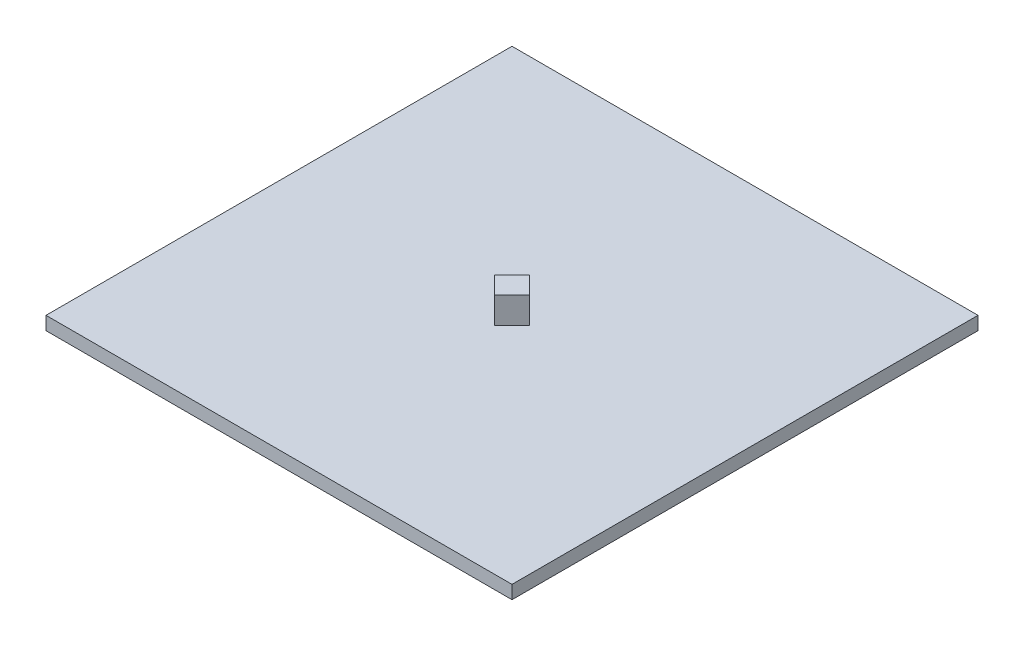
ISO-10303-21;
HEADER;
FILE_DESCRIPTION(('STEP AP214'),'2;1');
FILE_NAME('part.step','',(''),(''),'','','');
FILE_SCHEMA(('AUTOMOTIVE_DESIGN { 1 0 10303 214 1 1 1 1 }'));
ENDSEC;
DATA;
#1=APPLICATION_CONTEXT('core data for automotive mechanical design processes');
#2=APPLICATION_PROTOCOL_DEFINITION('international standard','automotive_design',2000,#1);
#3=PRODUCT_CONTEXT('',#1,'mechanical');
#4=PRODUCT('Part','Part','',(#3));
#5=PRODUCT_RELATED_PRODUCT_CATEGORY('part','',(#4));
#6=PRODUCT_DEFINITION_FORMATION('','',#4);
#7=PRODUCT_DEFINITION_CONTEXT('part definition',#1,'design');
#8=PRODUCT_DEFINITION('design','',#6,#7);
#9=PRODUCT_DEFINITION_SHAPE('','',#8);
#10=(LENGTH_UNIT() NAMED_UNIT(*) SI_UNIT(.MILLI.,.METRE.));
#11=(NAMED_UNIT(*) PLANE_ANGLE_UNIT() SI_UNIT($,.RADIAN.));
#12=(NAMED_UNIT(*) SI_UNIT($,.STERADIAN.) SOLID_ANGLE_UNIT());
#13=UNCERTAINTY_MEASURE_WITH_UNIT(LENGTH_MEASURE(1.E-05),#10,'distance_accuracy_value','');
#14=(GEOMETRIC_REPRESENTATION_CONTEXT(3) GLOBAL_UNCERTAINTY_ASSIGNED_CONTEXT((#13)) GLOBAL_UNIT_ASSIGNED_CONTEXT((#10,
#11,#12)) REPRESENTATION_CONTEXT('',''));
#15=CARTESIAN_POINT('',(0.,0.,0.));
#16=DIRECTION('',(0.,0.,1.));
#17=DIRECTION('',(1.,0.,0.));
#18=AXIS2_PLACEMENT_3D('',#15,#16,#17);
#19=CARTESIAN_POINT('',(0.,2.54,0.));
#20=DIRECTION('',(0.,-1.,0.));
#21=DIRECTION('',(0.,0.,-1.));
#22=AXIS2_PLACEMENT_3D('',#19,#20,#21);
#23=PLANE('',#22);
#24=DIRECTION('',(0.,0.,-1.));
#25=VECTOR('',#24,1.);
#26=CARTESIAN_POINT('',(44.45,2.54,44.45));
#27=LINE('',#26,#25);
#28=CARTESIAN_POINT('',(44.45,2.54,44.45));
#29=VERTEX_POINT('',#28);
#30=CARTESIAN_POINT('',(44.45,2.54,-44.45));
#31=VERTEX_POINT('',#30);
#32=EDGE_CURVE('E132',#29,#31,#27,.T.);
#33=ORIENTED_EDGE('',*,*,#32,.T.);
#34=DIRECTION('',(-1.,0.,0.));
#35=VECTOR('',#34,1.);
#36=CARTESIAN_POINT('',(-44.45,2.54,-44.45));
#37=LINE('',#36,#35);
#38=CARTESIAN_POINT('',(-44.45,2.54,-44.45));
#39=VERTEX_POINT('',#38);
#40=EDGE_CURVE('E135',#31,#39,#37,.T.);
#41=ORIENTED_EDGE('',*,*,#40,.T.);
#42=DIRECTION('',(0.,0.,1.));
#43=VECTOR('',#42,1.);
#44=CARTESIAN_POINT('',(-44.45,2.54,44.45));
#45=LINE('',#44,#43);
#46=CARTESIAN_POINT('',(-44.45,2.54,44.45));
#47=VERTEX_POINT('',#46);
#48=EDGE_CURVE('E138',#39,#47,#45,.T.);
#49=ORIENTED_EDGE('',*,*,#48,.T.);
#50=DIRECTION('',(1.,0.,0.));
#51=VECTOR('',#50,1.);
#52=CARTESIAN_POINT('',(-44.45,2.54,44.45));
#53=LINE('',#52,#51);
#54=EDGE_CURVE('E140',#47,#29,#53,.T.);
#55=ORIENTED_EDGE('',*,*,#54,.T.);
#56=EDGE_LOOP('',(#33,#41,#49,#55));
#57=FACE_BOUND('',#56,.T.);
#58=DIRECTION('',(-0.707106781186548,0.,-0.707106781186548));
#59=VECTOR('',#58,1.);
#60=CARTESIAN_POINT('',(3.3587572106361,2.54,0.));
#61=LINE('',#60,#59);
#62=CARTESIAN_POINT('',(3.3587572106361,2.54,0.));
#63=VERTEX_POINT('',#62);
#64=CARTESIAN_POINT('',(0.,2.54,-3.3587572106361));
#65=VERTEX_POINT('',#64);
#66=EDGE_CURVE('E122',#63,#65,#61,.T.);
#67=ORIENTED_EDGE('',*,*,#66,.F.);
#68=DIRECTION('',(0.707106781186547,0.,-0.707106781186548));
#69=VECTOR('',#68,1.);
#70=CARTESIAN_POINT('',(0.,2.54,3.3587572106361));
#71=LINE('',#70,#69);
#72=CARTESIAN_POINT('',(0.,2.54,3.3587572106361));
#73=VERTEX_POINT('',#72);
#74=EDGE_CURVE('E119',#73,#63,#71,.T.);
#75=ORIENTED_EDGE('',*,*,#74,.F.);
#76=DIRECTION('',(0.707106781186547,0.,0.707106781186548));
#77=VECTOR('',#76,1.);
#78=CARTESIAN_POINT('',(0.,2.54,3.3587572106361));
#79=LINE('',#78,#77);
#80=CARTESIAN_POINT('',(-3.3587572106361,2.54,0.));
#81=VERTEX_POINT('',#80);
#82=EDGE_CURVE('E57',#81,#73,#79,.T.);
#83=ORIENTED_EDGE('',*,*,#82,.F.);
#84=DIRECTION('',(-0.707106781186548,0.,0.707106781186548));
#85=VECTOR('',#84,1.);
#86=CARTESIAN_POINT('',(-3.3587572106361,2.54,0.));
#87=LINE('',#86,#85);
#88=EDGE_CURVE('E52',#65,#81,#87,.T.);
#89=ORIENTED_EDGE('',*,*,#88,.F.);
#90=EDGE_LOOP('',(#67,#75,#83,#89));
#91=FACE_BOUND('',#90,.T.);
#92=ADVANCED_FACE('F37',(#57,#91),#23,.F.);
#93=CARTESIAN_POINT('',(44.45,2.54,44.45));
#94=DIRECTION('',(-1.,0.,0.));
#95=DIRECTION('',(0.,0.,1.));
#96=AXIS2_PLACEMENT_3D('',#93,#94,#95);
#97=PLANE('',#96);
#98=DIRECTION('',(0.,0.,-1.));
#99=VECTOR('',#98,1.);
#100=CARTESIAN_POINT('',(44.45,0.,44.45));
#101=LINE('',#100,#99);
#102=CARTESIAN_POINT('',(44.45,0.,44.45));
#103=VERTEX_POINT('',#102);
#104=CARTESIAN_POINT('',(44.45,0.,-44.45));
#105=VERTEX_POINT('',#104);
#106=EDGE_CURVE('E123',#103,#105,#101,.T.);
#107=ORIENTED_EDGE('',*,*,#106,.T.);
#108=DIRECTION('',(0.,-1.,0.));
#109=VECTOR('',#108,1.);
#110=CARTESIAN_POINT('',(44.45,2.54,-44.45));
#111=LINE('',#110,#109);
#112=EDGE_CURVE('E11',#31,#105,#111,.T.);
#113=ORIENTED_EDGE('',*,*,#112,.F.);
#114=ORIENTED_EDGE('',*,*,#32,.F.);
#115=DIRECTION('',(0.,-1.,0.));
#116=VECTOR('',#115,1.);
#117=CARTESIAN_POINT('',(44.45,2.54,44.45));
#118=LINE('',#117,#116);
#119=EDGE_CURVE('E141',#29,#103,#118,.T.);
#120=ORIENTED_EDGE('',*,*,#119,.T.);
#121=EDGE_LOOP('',(#107,#113,#114,#120));
#122=FACE_BOUND('',#121,.T.);
#123=ADVANCED_FACE('F39',(#122),#97,.F.);
#124=CARTESIAN_POINT('',(-44.45,2.54,-44.45));
#125=DIRECTION('',(0.,0.,1.));
#126=DIRECTION('',(1.,0.,0.));
#127=AXIS2_PLACEMENT_3D('',#124,#125,#126);
#128=PLANE('',#127);
#129=DIRECTION('',(-1.,0.,0.));
#130=VECTOR('',#129,1.);
#131=CARTESIAN_POINT('',(-44.45,0.,-44.45));
#132=LINE('',#131,#130);
#133=CARTESIAN_POINT('',(-44.45,0.,-44.45));
#134=VERTEX_POINT('',#133);
#135=EDGE_CURVE('E126',#105,#134,#132,.T.);
#136=ORIENTED_EDGE('',*,*,#135,.T.);
#137=DIRECTION('',(0.,-1.,0.));
#138=VECTOR('',#137,1.);
#139=CARTESIAN_POINT('',(-44.45,2.54,-44.45));
#140=LINE('',#139,#138);
#141=EDGE_CURVE('E45',#39,#134,#140,.T.);
#142=ORIENTED_EDGE('',*,*,#141,.F.);
#143=ORIENTED_EDGE('',*,*,#40,.F.);
#144=ORIENTED_EDGE('',*,*,#112,.T.);
#145=EDGE_LOOP('',(#136,#142,#143,#144));
#146=FACE_BOUND('',#145,.T.);
#147=ADVANCED_FACE('F171',(#146),#128,.F.);
#148=CARTESIAN_POINT('',(-44.45,2.54,44.45));
#149=DIRECTION('',(1.,0.,0.));
#150=DIRECTION('',(0.,0.,-1.));
#151=AXIS2_PLACEMENT_3D('',#148,#149,#150);
#152=PLANE('',#151);
#153=DIRECTION('',(0.,0.,1.));
#154=VECTOR('',#153,1.);
#155=CARTESIAN_POINT('',(-44.45,0.,44.45));
#156=LINE('',#155,#154);
#157=CARTESIAN_POINT('',(-44.45,0.,44.45));
#158=VERTEX_POINT('',#157);
#159=EDGE_CURVE('E144',#134,#158,#156,.T.);
#160=ORIENTED_EDGE('',*,*,#159,.T.);
#161=DIRECTION('',(0.,-1.,0.));
#162=VECTOR('',#161,1.);
#163=CARTESIAN_POINT('',(-44.45,2.54,44.45));
#164=LINE('',#163,#162);
#165=EDGE_CURVE('E149',#47,#158,#164,.T.);
#166=ORIENTED_EDGE('',*,*,#165,.F.);
#167=ORIENTED_EDGE('',*,*,#48,.F.);
#168=ORIENTED_EDGE('',*,*,#141,.T.);
#169=EDGE_LOOP('',(#160,#166,#167,#168));
#170=FACE_BOUND('',#169,.T.);
#171=ADVANCED_FACE('F156',(#170),#152,.F.);
#172=CARTESIAN_POINT('',(-44.45,2.54,44.45));
#173=DIRECTION('',(0.,0.,-1.));
#174=DIRECTION('',(-1.,0.,0.));
#175=AXIS2_PLACEMENT_3D('',#172,#173,#174);
#176=PLANE('',#175);
#177=DIRECTION('',(1.,0.,0.));
#178=VECTOR('',#177,1.);
#179=CARTESIAN_POINT('',(-44.45,0.,44.45));
#180=LINE('',#179,#178);
#181=EDGE_CURVE('E136',#158,#103,#180,.T.);
#182=ORIENTED_EDGE('',*,*,#181,.T.);
#183=ORIENTED_EDGE('',*,*,#119,.F.);
#184=ORIENTED_EDGE('',*,*,#54,.F.);
#185=ORIENTED_EDGE('',*,*,#165,.T.);
#186=EDGE_LOOP('',(#182,#183,#184,#185));
#187=FACE_BOUND('',#186,.T.);
#188=ADVANCED_FACE('F165',(#187),#176,.F.);
#189=CARTESIAN_POINT('',(0.,0.,0.));
#190=DIRECTION('',(0.,-1.,0.));
#191=DIRECTION('',(0.,0.,-1.));
#192=AXIS2_PLACEMENT_3D('',#189,#190,#191);
#193=PLANE('',#192);
#194=ORIENTED_EDGE('',*,*,#106,.F.);
#195=ORIENTED_EDGE('',*,*,#181,.F.);
#196=ORIENTED_EDGE('',*,*,#159,.F.);
#197=ORIENTED_EDGE('',*,*,#135,.F.);
#198=EDGE_LOOP('',(#194,#195,#196,#197));
#199=FACE_BOUND('',#198,.T.);
#200=ADVANCED_FACE('F162',(#199),#193,.T.);
#201=CARTESIAN_POINT('',(3.3587572106361,7.54,0.));
#202=DIRECTION('',(-0.707106781186548,0.,0.707106781186548));
#203=DIRECTION('',(0.707106781186548,0.,0.707106781186548));
#204=AXIS2_PLACEMENT_3D('',#201,#202,#203);
#205=PLANE('',#204);
#206=ORIENTED_EDGE('',*,*,#66,.T.);
#207=DIRECTION('',(0.,-1.,0.));
#208=VECTOR('',#207,1.);
#209=CARTESIAN_POINT('',(0.,7.54,-3.3587572106361));
#210=LINE('',#209,#208);
#211=CARTESIAN_POINT('',(0.,7.54,-3.3587572106361));
#212=VERTEX_POINT('',#211);
#213=EDGE_CURVE('E103',#212,#65,#210,.T.);
#214=ORIENTED_EDGE('',*,*,#213,.F.);
#215=DIRECTION('',(-0.707106781186548,0.,-0.707106781186548));
#216=VECTOR('',#215,1.);
#217=CARTESIAN_POINT('',(3.3587572106361,7.54,0.));
#218=LINE('',#217,#216);
#219=CARTESIAN_POINT('',(3.3587572106361,7.54,0.));
#220=VERTEX_POINT('',#219);
#221=EDGE_CURVE('E110',#220,#212,#218,.T.);
#222=ORIENTED_EDGE('',*,*,#221,.F.);
#223=DIRECTION('',(0.,-1.,0.));
#224=VECTOR('',#223,1.);
#225=CARTESIAN_POINT('',(3.3587572106361,7.54,0.));
#226=LINE('',#225,#224);
#227=EDGE_CURVE('E286',#220,#63,#226,.T.);
#228=ORIENTED_EDGE('',*,*,#227,.T.);
#229=EDGE_LOOP('',(#206,#214,#222,#228));
#230=FACE_BOUND('',#229,.T.);
#231=ADVANCED_FACE('F121',(#230),#205,.F.);
#232=CARTESIAN_POINT('',(-3.3587572106361,7.54,0.));
#233=DIRECTION('',(0.707106781186548,0.,0.707106781186548));
#234=DIRECTION('',(0.707106781186548,0.,-0.707106781186548));
#235=AXIS2_PLACEMENT_3D('',#232,#233,#234);
#236=PLANE('',#235);
#237=ORIENTED_EDGE('',*,*,#88,.T.);
#238=DIRECTION('',(0.,-1.,0.));
#239=VECTOR('',#238,1.);
#240=CARTESIAN_POINT('',(-3.3587572106361,7.54,0.));
#241=LINE('',#240,#239);
#242=CARTESIAN_POINT('',(-3.3587572106361,7.54,0.));
#243=VERTEX_POINT('',#242);
#244=EDGE_CURVE('E106',#243,#81,#241,.T.);
#245=ORIENTED_EDGE('',*,*,#244,.F.);
#246=DIRECTION('',(-0.707106781186548,0.,0.707106781186548));
#247=VECTOR('',#246,1.);
#248=CARTESIAN_POINT('',(-3.3587572106361,7.54,0.));
#249=LINE('',#248,#247);
#250=EDGE_CURVE('E99',#212,#243,#249,.T.);
#251=ORIENTED_EDGE('',*,*,#250,.F.);
#252=ORIENTED_EDGE('',*,*,#213,.T.);
#253=EDGE_LOOP('',(#237,#245,#251,#252));
#254=FACE_BOUND('',#253,.T.);
#255=ADVANCED_FACE('F101',(#254),#236,.F.);
#256=CARTESIAN_POINT('',(0.,7.54,3.3587572106361));
#257=DIRECTION('',(0.707106781186548,0.,-0.707106781186547));
#258=DIRECTION('',(-0.707106781186547,0.,-0.707106781186548));
#259=AXIS2_PLACEMENT_3D('',#256,#257,#258);
#260=PLANE('',#259);
#261=ORIENTED_EDGE('',*,*,#82,.T.);
#262=DIRECTION('',(0.,-1.,0.));
#263=VECTOR('',#262,1.);
#264=CARTESIAN_POINT('',(0.,7.54,3.3587572106361));
#265=LINE('',#264,#263);
#266=CARTESIAN_POINT('',(0.,7.54,3.3587572106361));
#267=VERTEX_POINT('',#266);
#268=EDGE_CURVE('E128',#267,#73,#265,.T.);
#269=ORIENTED_EDGE('',*,*,#268,.F.);
#270=DIRECTION('',(0.707106781186547,0.,0.707106781186548));
#271=VECTOR('',#270,1.);
#272=CARTESIAN_POINT('',(0.,7.54,3.3587572106361));
#273=LINE('',#272,#271);
#274=EDGE_CURVE('E109',#243,#267,#273,.T.);
#275=ORIENTED_EDGE('',*,*,#274,.F.);
#276=ORIENTED_EDGE('',*,*,#244,.T.);
#277=EDGE_LOOP('',(#261,#269,#275,#276));
#278=FACE_BOUND('',#277,.T.);
#279=ADVANCED_FACE('F212',(#278),#260,.F.);
#280=CARTESIAN_POINT('',(0.,7.54,3.3587572106361));
#281=DIRECTION('',(-0.707106781186548,0.,-0.707106781186547));
#282=DIRECTION('',(-0.707106781186547,0.,0.707106781186548));
#283=AXIS2_PLACEMENT_3D('',#280,#281,#282);
#284=PLANE('',#283);
#285=ORIENTED_EDGE('',*,*,#74,.T.);
#286=ORIENTED_EDGE('',*,*,#227,.F.);
#287=DIRECTION('',(0.707106781186547,0.,-0.707106781186548));
#288=VECTOR('',#287,1.);
#289=CARTESIAN_POINT('',(0.,7.54,3.3587572106361));
#290=LINE('',#289,#288);
#291=EDGE_CURVE('E115',#267,#220,#290,.T.);
#292=ORIENTED_EDGE('',*,*,#291,.F.);
#293=ORIENTED_EDGE('',*,*,#268,.T.);
#294=EDGE_LOOP('',(#285,#286,#292,#293));
#295=FACE_BOUND('',#294,.T.);
#296=ADVANCED_FACE('F218',(#295),#284,.F.);
#297=CARTESIAN_POINT('',(0.,7.54,0.));
#298=DIRECTION('',(0.,-1.,0.));
#299=DIRECTION('',(0.,0.,-1.));
#300=AXIS2_PLACEMENT_3D('',#297,#298,#299);
#301=PLANE('',#300);
#302=ORIENTED_EDGE('',*,*,#221,.T.);
#303=ORIENTED_EDGE('',*,*,#250,.T.);
#304=ORIENTED_EDGE('',*,*,#274,.T.);
#305=ORIENTED_EDGE('',*,*,#291,.T.);
#306=EDGE_LOOP('',(#302,#303,#304,#305));
#307=FACE_BOUND('',#306,.T.);
#308=ADVANCED_FACE('F113',(#307),#301,.F.);
#309=CLOSED_SHELL('',(#92,#123,#147,#171,#188,#200,#231,#255,#279,#296,#308));
#310=MANIFOLD_SOLID_BREP('B2',#309);
#311=ADVANCED_BREP_SHAPE_REPRESENTATION('',(#18,#310),#14);
#312=SHAPE_DEFINITION_REPRESENTATION(#9,#311);
ENDSEC;
END-ISO-10303-21;
